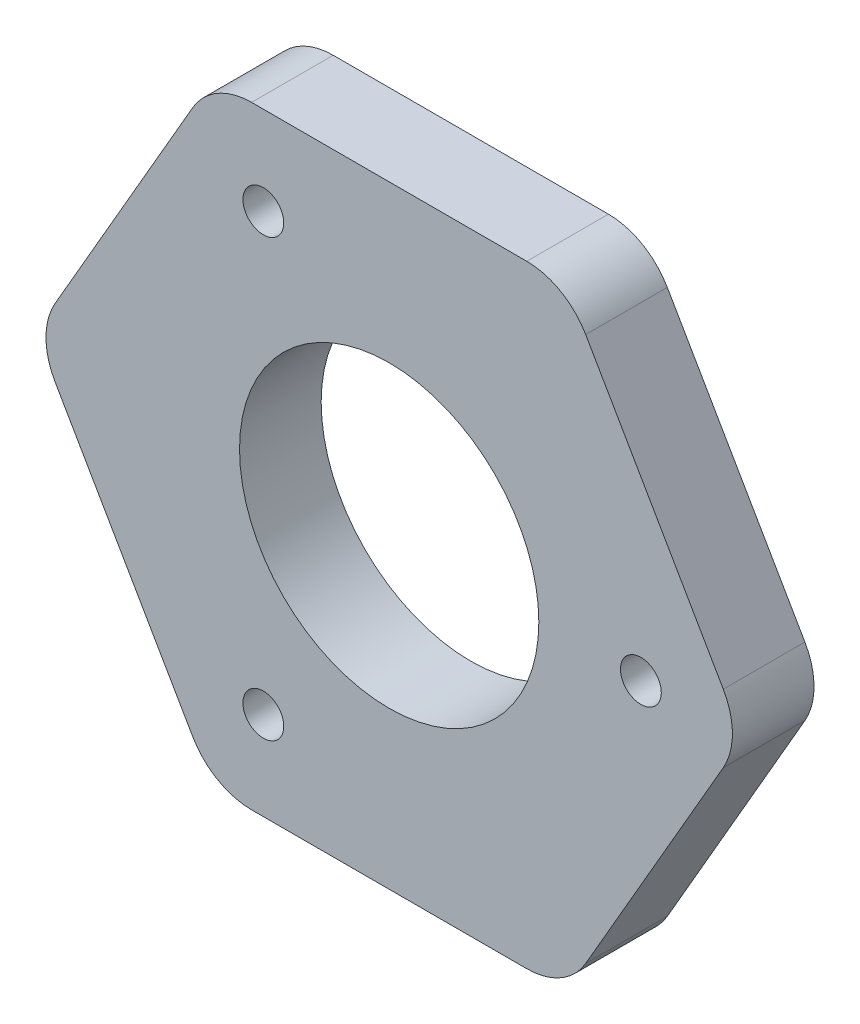
ISO-10303-21;
HEADER;
FILE_DESCRIPTION(('STEP AP214'),'2;1');
FILE_NAME('part.step','',(''),(''),'','','');
FILE_SCHEMA(('AUTOMOTIVE_DESIGN { 1 0 10303 214 1 1 1 1 }'));
ENDSEC;
DATA;
#1=APPLICATION_CONTEXT('core data for automotive mechanical design processes');
#2=APPLICATION_PROTOCOL_DEFINITION('international standard','automotive_design',2000,#1);
#3=PRODUCT_CONTEXT('',#1,'mechanical');
#4=PRODUCT('Part','Part','',(#3));
#5=PRODUCT_RELATED_PRODUCT_CATEGORY('part','',(#4));
#6=PRODUCT_DEFINITION_FORMATION('','',#4);
#7=PRODUCT_DEFINITION_CONTEXT('part definition',#1,'design');
#8=PRODUCT_DEFINITION('design','',#6,#7);
#9=PRODUCT_DEFINITION_SHAPE('','',#8);
#10=(LENGTH_UNIT() NAMED_UNIT(*) SI_UNIT(.MILLI.,.METRE.));
#11=(NAMED_UNIT(*) PLANE_ANGLE_UNIT() SI_UNIT($,.RADIAN.));
#12=(NAMED_UNIT(*) SI_UNIT($,.STERADIAN.) SOLID_ANGLE_UNIT());
#13=UNCERTAINTY_MEASURE_WITH_UNIT(LENGTH_MEASURE(1.E-05),#10,'distance_accuracy_value','');
#14=(GEOMETRIC_REPRESENTATION_CONTEXT(3) GLOBAL_UNCERTAINTY_ASSIGNED_CONTEXT((#13)) GLOBAL_UNIT_ASSIGNED_CONTEXT((#10,
#11,#12)) REPRESENTATION_CONTEXT('',''));
#15=CARTESIAN_POINT('',(0.,0.,0.));
#16=DIRECTION('',(0.,0.,1.));
#17=DIRECTION('',(1.,0.,0.));
#18=AXIS2_PLACEMENT_3D('',#15,#16,#17);
#19=CARTESIAN_POINT('',(-57.1009704413771,86.3066604984849,6.));
#20=DIRECTION('',(0.,0.,1.));
#21=DIRECTION('',(1.,0.,0.));
#22=AXIS2_PLACEMENT_3D('',#19,#20,#21);
#23=PLANE('',#22);
#24=CARTESIAN_POINT('',(-46.9877217872398,68.7899999999777,6.));
#25=DIRECTION('',(0.,0.,1.));
#26=DIRECTION('',(1.,0.,0.));
#27=AXIS2_PLACEMENT_3D('',#24,#25,#26);
#28=CIRCLE('',#27,10.999999999969);
#29=CARTESIAN_POINT('',(-35.9877217872708,68.7899999999777,6.));
#30=VERTEX_POINT('',#29);
#31=EDGE_CURVE('E299',#30,#30,#28,.T.);
#32=ORIENTED_EDGE('',*,*,#31,.F.);
#33=EDGE_LOOP('',(#32));
#34=FACE_BOUND('',#33,.T.);
#35=CARTESIAN_POINT('',(-56.2377217872788,52.7685300299879,6.));
#36=DIRECTION('',(0.,0.,1.));
#37=DIRECTION('',(1.,0.,0.));
#38=AXIS2_PLACEMENT_3D('',#35,#36,#37);
#39=CIRCLE('',#38,1.5);
#40=CARTESIAN_POINT('',(-54.7377217872788,52.7685300299879,6.));
#41=VERTEX_POINT('',#40);
#42=EDGE_CURVE('E166',#41,#41,#39,.T.);
#43=ORIENTED_EDGE('',*,*,#42,.F.);
#44=EDGE_LOOP('',(#43));
#45=FACE_BOUND('',#44,.T.);
#46=CARTESIAN_POINT('',(-57.1009704413771,86.3066604984849,6.));
#47=DIRECTION('',(0.,0.,1.));
#48=DIRECTION('',(1.,0.,0.));
#49=AXIS2_PLACEMENT_3D('',#46,#47,#48);
#50=CIRCLE('',#49,5.00000000000002);
#51=CARTESIAN_POINT('',(-57.1009704413761,91.3066604984849,6.));
#52=VERTEX_POINT('',#51);
#53=CARTESIAN_POINT('',(-61.4310974603012,88.8066604984817,6.));
#54=VERTEX_POINT('',#53);
#55=EDGE_CURVE('E185',#52,#54,#50,.T.);
#56=ORIENTED_EDGE('',*,*,#55,.T.);
#57=DIRECTION('',(-0.499999999999351,-0.866025403784813,0.));
#58=VECTOR('',#57,1.);
#59=CARTESIAN_POINT('',(-61.4310974603012,88.8066604984817,6.));
#60=LINE('',#59,#58);
#61=CARTESIAN_POINT('',(-71.5443461143398,71.2900000000789,6.));
#62=VERTEX_POINT('',#61);
#63=EDGE_CURVE('E113',#54,#62,#60,.T.);
#64=ORIENTED_EDGE('',*,*,#63,.T.);
#65=CARTESIAN_POINT('',(-67.2142190954157,68.7900000000821,6.));
#66=DIRECTION('',(0.,0.,1.));
#67=DIRECTION('',(1.,0.,0.));
#68=AXIS2_PLACEMENT_3D('',#65,#66,#67);
#69=CIRCLE('',#68,5.00000000000002);
#70=CARTESIAN_POINT('',(-71.5443461143394,66.2900000000848,6.));
#71=VERTEX_POINT('',#70);
#72=EDGE_CURVE('E212',#62,#71,#69,.T.);
#73=ORIENTED_EDGE('',*,*,#72,.T.);
#74=DIRECTION('',(0.499999999999477,-0.866025403784741,0.));
#75=VECTOR('',#74,1.);
#76=CARTESIAN_POINT('',(-71.5443461143394,66.2900000000848,6.));
#77=LINE('',#76,#75);
#78=CARTESIAN_POINT('',(-61.4310974602983,48.7733395016834,6.));
#79=VERTEX_POINT('',#78);
#80=EDGE_CURVE('E231',#71,#79,#77,.T.);
#81=ORIENTED_EDGE('',*,*,#80,.T.);
#82=CARTESIAN_POINT('',(-57.1009704413746,51.2733395016808,6.));
#83=DIRECTION('',(0.,0.,1.));
#84=DIRECTION('',(1.,0.,0.));
#85=AXIS2_PLACEMENT_3D('',#82,#83,#84);
#86=CIRCLE('',#85,5.);
#87=CARTESIAN_POINT('',(-57.1009704413746,46.2733395016808,6.));
#88=VERTEX_POINT('',#87);
#89=EDGE_CURVE('E228',#79,#88,#86,.T.);
#90=ORIENTED_EDGE('',*,*,#89,.T.);
#91=DIRECTION('',(1.,0.,0.));
#92=VECTOR('',#91,1.);
#93=CARTESIAN_POINT('',(-57.1009704413746,46.2733395016808,6.));
#94=LINE('',#93,#92);
#95=CARTESIAN_POINT('',(-36.8744731332711,46.2733395016808,6.));
#96=VERTEX_POINT('',#95);
#97=EDGE_CURVE('E230',#88,#96,#94,.T.);
#98=ORIENTED_EDGE('',*,*,#97,.T.);
#99=CARTESIAN_POINT('',(-36.8744731332807,51.2733395016808,6.));
#100=DIRECTION('',(0.,0.,1.));
#101=DIRECTION('',(1.,0.,0.));
#102=AXIS2_PLACEMENT_3D('',#99,#100,#101);
#103=CIRCLE('',#102,5.00000000000002);
#104=CARTESIAN_POINT('',(-32.5443461143537,48.7733395016891,6.));
#105=VERTEX_POINT('',#104);
#106=EDGE_CURVE('E233',#96,#105,#103,.T.);
#107=ORIENTED_EDGE('',*,*,#106,.T.);
#108=DIRECTION('',(0.500000000000004,0.866025403784436,0.));
#109=VECTOR('',#108,1.);
#110=CARTESIAN_POINT('',(-32.5443461143537,48.7733395016891,6.));
#111=LINE('',#110,#109);
#112=CARTESIAN_POINT('',(-22.4310974603018,66.2900000000843,6.));
#113=VERTEX_POINT('',#112);
#114=EDGE_CURVE('E239',#105,#113,#111,.T.);
#115=ORIENTED_EDGE('',*,*,#114,.T.);
#116=CARTESIAN_POINT('',(-26.761224479224,68.7900000000843,6.));
#117=DIRECTION('',(0.,0.,1.));
#118=DIRECTION('',(1.,0.,0.));
#119=AXIS2_PLACEMENT_3D('',#116,#117,#118);
#120=CIRCLE('',#119,5.00000000000002);
#121=CARTESIAN_POINT('',(-22.4310974603015,71.2900000000838,6.));
#122=VERTEX_POINT('',#121);
#123=EDGE_CURVE('E144',#113,#122,#120,.T.);
#124=ORIENTED_EDGE('',*,*,#123,.T.);
#125=DIRECTION('',(-0.499999999999893,0.8660254037845,0.));
#126=VECTOR('',#125,1.);
#127=CARTESIAN_POINT('',(-22.4310974603015,71.2900000000838,6.));
#128=LINE('',#127,#126);
#129=CARTESIAN_POINT('',(-32.5443461143511,88.8066604984802,6.));
#130=VERTEX_POINT('',#129);
#131=EDGE_CURVE('E138',#122,#130,#128,.T.);
#132=ORIENTED_EDGE('',*,*,#131,.T.);
#133=CARTESIAN_POINT('',(-36.8744731332736,86.3066604984808,6.));
#134=DIRECTION('',(0.,0.,1.));
#135=DIRECTION('',(1.,0.,0.));
#136=AXIS2_PLACEMENT_3D('',#133,#134,#135);
#137=CIRCLE('',#136,5.00000000000002);
#138=CARTESIAN_POINT('',(-36.8744731332726,91.3066604984808,6.));
#139=VERTEX_POINT('',#138);
#140=EDGE_CURVE('E142',#130,#139,#137,.T.);
#141=ORIENTED_EDGE('',*,*,#140,.T.);
#142=DIRECTION('',(-1.,2.05835754897431E-13,0.));
#143=VECTOR('',#142,1.);
#144=CARTESIAN_POINT('',(-36.8744731332726,91.3066604984808,6.));
#145=LINE('',#144,#143);
#146=EDGE_CURVE('E58',#139,#52,#145,.T.);
#147=ORIENTED_EDGE('',*,*,#146,.T.);
#148=EDGE_LOOP('',(#56,#64,#73,#81,#90,#98,#107,#115,#124,#132,#141,#147));
#149=FACE_BOUND('',#148,.T.);
#150=CARTESIAN_POINT('',(-28.48772178724,68.7899999999329,6.));
#151=DIRECTION('',(0.,0.,1.));
#152=DIRECTION('',(1.,0.,0.));
#153=AXIS2_PLACEMENT_3D('',#150,#151,#152);
#154=CIRCLE('',#153,1.49999999998257);
#155=CARTESIAN_POINT('',(-26.9877217872574,68.7899999999329,6.));
#156=VERTEX_POINT('',#155);
#157=EDGE_CURVE('E305',#156,#156,#154,.T.);
#158=ORIENTED_EDGE('',*,*,#157,.F.);
#159=EDGE_LOOP('',(#158));
#160=FACE_BOUND('',#159,.T.);
#161=CARTESIAN_POINT('',(-56.2377217872012,84.8114699700121,6.));
#162=DIRECTION('',(0.,0.,1.));
#163=DIRECTION('',(1.,0.,0.));
#164=AXIS2_PLACEMENT_3D('',#161,#162,#163);
#165=CIRCLE('',#164,1.49999999992592);
#166=CARTESIAN_POINT('',(-54.7377217872752,84.8114699700121,6.));
#167=VERTEX_POINT('',#166);
#168=EDGE_CURVE('E290',#167,#167,#165,.T.);
#169=ORIENTED_EDGE('',*,*,#168,.F.);
#170=EDGE_LOOP('',(#169));
#171=FACE_BOUND('',#170,.T.);
#172=ADVANCED_FACE('F41',(#34,#45,#149,#160,#171),#23,.T.);
#173=CARTESIAN_POINT('',(-57.1009704413771,86.3066604984849,0.));
#174=DIRECTION('',(0.,0.,1.));
#175=DIRECTION('',(1.,0.,0.));
#176=AXIS2_PLACEMENT_3D('',#173,#174,#175);
#177=PLANE('',#176);
#178=CARTESIAN_POINT('',(-57.1009704413771,86.3066604984849,0.));
#179=DIRECTION('',(0.,0.,1.));
#180=DIRECTION('',(1.,0.,0.));
#181=AXIS2_PLACEMENT_3D('',#178,#179,#180);
#182=CIRCLE('',#181,5.00000000000002);
#183=CARTESIAN_POINT('',(-57.1009704413761,91.3066604984849,0.));
#184=VERTEX_POINT('',#183);
#185=CARTESIAN_POINT('',(-61.4310974603012,88.8066604984817,0.));
#186=VERTEX_POINT('',#185);
#187=EDGE_CURVE('E162',#184,#186,#182,.T.);
#188=ORIENTED_EDGE('',*,*,#187,.F.);
#189=DIRECTION('',(-1.,2.05835754897431E-13,0.));
#190=VECTOR('',#189,1.);
#191=CARTESIAN_POINT('',(-36.8744731332726,91.3066604984808,0.));
#192=LINE('',#191,#190);
#193=CARTESIAN_POINT('',(-36.8744731332726,91.3066604984808,0.));
#194=VERTEX_POINT('',#193);
#195=EDGE_CURVE('E105',#194,#184,#192,.T.);
#196=ORIENTED_EDGE('',*,*,#195,.F.);
#197=CARTESIAN_POINT('',(-36.8744731332736,86.3066604984808,0.));
#198=DIRECTION('',(0.,0.,1.));
#199=DIRECTION('',(1.,0.,0.));
#200=AXIS2_PLACEMENT_3D('',#197,#198,#199);
#201=CIRCLE('',#200,5.00000000000002);
#202=CARTESIAN_POINT('',(-32.5443461143511,88.8066604984802,0.));
#203=VERTEX_POINT('',#202);
#204=EDGE_CURVE('E99',#203,#194,#201,.T.);
#205=ORIENTED_EDGE('',*,*,#204,.F.);
#206=DIRECTION('',(-0.499999999999893,0.8660254037845,0.));
#207=VECTOR('',#206,1.);
#208=CARTESIAN_POINT('',(-22.4310974603015,71.2900000000838,0.));
#209=LINE('',#208,#207);
#210=CARTESIAN_POINT('',(-22.4310974603015,71.2900000000838,0.));
#211=VERTEX_POINT('',#210);
#212=EDGE_CURVE('E152',#211,#203,#209,.T.);
#213=ORIENTED_EDGE('',*,*,#212,.F.);
#214=CARTESIAN_POINT('',(-26.761224479224,68.7900000000843,0.));
#215=DIRECTION('',(0.,0.,1.));
#216=DIRECTION('',(1.,0.,0.));
#217=AXIS2_PLACEMENT_3D('',#214,#215,#216);
#218=CIRCLE('',#217,5.00000000000002);
#219=CARTESIAN_POINT('',(-22.4310974603018,66.2900000000843,0.));
#220=VERTEX_POINT('',#219);
#221=EDGE_CURVE('E180',#220,#211,#218,.T.);
#222=ORIENTED_EDGE('',*,*,#221,.F.);
#223=DIRECTION('',(0.500000000000004,0.866025403784436,0.));
#224=VECTOR('',#223,1.);
#225=CARTESIAN_POINT('',(-32.5443461143537,48.7733395016891,0.));
#226=LINE('',#225,#224);
#227=CARTESIAN_POINT('',(-32.5443461143537,48.7733395016891,0.));
#228=VERTEX_POINT('',#227);
#229=EDGE_CURVE('E178',#228,#220,#226,.T.);
#230=ORIENTED_EDGE('',*,*,#229,.F.);
#231=CARTESIAN_POINT('',(-36.8744731332807,51.2733395016808,0.));
#232=DIRECTION('',(0.,0.,1.));
#233=DIRECTION('',(1.,0.,0.));
#234=AXIS2_PLACEMENT_3D('',#231,#232,#233);
#235=CIRCLE('',#234,5.00000000000002);
#236=CARTESIAN_POINT('',(-36.8744731332711,46.2733395016808,0.));
#237=VERTEX_POINT('',#236);
#238=EDGE_CURVE('E176',#237,#228,#235,.T.);
#239=ORIENTED_EDGE('',*,*,#238,.F.);
#240=DIRECTION('',(1.,0.,0.));
#241=VECTOR('',#240,1.);
#242=CARTESIAN_POINT('',(-57.1009704413746,46.2733395016808,0.));
#243=LINE('',#242,#241);
#244=CARTESIAN_POINT('',(-57.1009704413746,46.2733395016808,0.));
#245=VERTEX_POINT('',#244);
#246=EDGE_CURVE('E174',#245,#237,#243,.T.);
#247=ORIENTED_EDGE('',*,*,#246,.F.);
#248=CARTESIAN_POINT('',(-57.1009704413746,51.2733395016808,0.));
#249=DIRECTION('',(0.,0.,1.));
#250=DIRECTION('',(1.,0.,0.));
#251=AXIS2_PLACEMENT_3D('',#248,#249,#250);
#252=CIRCLE('',#251,5.);
#253=CARTESIAN_POINT('',(-61.4310974602983,48.7733395016834,0.));
#254=VERTEX_POINT('',#253);
#255=EDGE_CURVE('E172',#254,#245,#252,.T.);
#256=ORIENTED_EDGE('',*,*,#255,.F.);
#257=DIRECTION('',(0.499999999999477,-0.866025403784741,0.));
#258=VECTOR('',#257,1.);
#259=CARTESIAN_POINT('',(-71.5443461143394,66.2900000000848,0.));
#260=LINE('',#259,#258);
#261=CARTESIAN_POINT('',(-71.5443461143394,66.2900000000848,0.));
#262=VERTEX_POINT('',#261);
#263=EDGE_CURVE('E170',#262,#254,#260,.T.);
#264=ORIENTED_EDGE('',*,*,#263,.F.);
#265=CARTESIAN_POINT('',(-67.2142190954157,68.7900000000821,0.));
#266=DIRECTION('',(0.,0.,1.));
#267=DIRECTION('',(1.,0.,0.));
#268=AXIS2_PLACEMENT_3D('',#265,#266,#267);
#269=CIRCLE('',#268,5.00000000000002);
#270=CARTESIAN_POINT('',(-71.5443461143398,71.2900000000789,0.));
#271=VERTEX_POINT('',#270);
#272=EDGE_CURVE('E168',#271,#262,#269,.T.);
#273=ORIENTED_EDGE('',*,*,#272,.F.);
#274=DIRECTION('',(-0.499999999999351,-0.866025403784813,0.));
#275=VECTOR('',#274,1.);
#276=CARTESIAN_POINT('',(-61.4310974603012,88.8066604984817,0.));
#277=LINE('',#276,#275);
#278=EDGE_CURVE('E165',#186,#271,#277,.T.);
#279=ORIENTED_EDGE('',*,*,#278,.F.);
#280=EDGE_LOOP('',(#188,#196,#205,#213,#222,#230,#239,#247,#256,#264,#273,#279));
#281=FACE_BOUND('',#280,.T.);
#282=CARTESIAN_POINT('',(-56.2377217872788,52.7685300299879,0.));
#283=DIRECTION('',(0.,0.,1.));
#284=DIRECTION('',(1.,0.,0.));
#285=AXIS2_PLACEMENT_3D('',#282,#283,#284);
#286=CIRCLE('',#285,1.5);
#287=CARTESIAN_POINT('',(-54.7377217872788,52.7685300299879,0.));
#288=VERTEX_POINT('',#287);
#289=EDGE_CURVE('E308',#288,#288,#286,.T.);
#290=ORIENTED_EDGE('',*,*,#289,.T.);
#291=EDGE_LOOP('',(#290));
#292=FACE_BOUND('',#291,.T.);
#293=CARTESIAN_POINT('',(-28.48772178724,68.7899999999329,0.));
#294=DIRECTION('',(0.,0.,1.));
#295=DIRECTION('',(1.,0.,0.));
#296=AXIS2_PLACEMENT_3D('',#293,#294,#295);
#297=CIRCLE('',#296,1.49999999998257);
#298=CARTESIAN_POINT('',(-26.9877217872574,68.7899999999329,0.));
#299=VERTEX_POINT('',#298);
#300=EDGE_CURVE('E302',#299,#299,#297,.T.);
#301=ORIENTED_EDGE('',*,*,#300,.T.);
#302=EDGE_LOOP('',(#301));
#303=FACE_BOUND('',#302,.T.);
#304=CARTESIAN_POINT('',(-46.9877217872398,68.7899999999777,0.));
#305=DIRECTION('',(0.,0.,1.));
#306=DIRECTION('',(1.,0.,0.));
#307=AXIS2_PLACEMENT_3D('',#304,#305,#306);
#308=CIRCLE('',#307,10.999999999969);
#309=CARTESIAN_POINT('',(-35.9877217872708,68.7899999999777,0.));
#310=VERTEX_POINT('',#309);
#311=EDGE_CURVE('E296',#310,#310,#308,.T.);
#312=ORIENTED_EDGE('',*,*,#311,.T.);
#313=EDGE_LOOP('',(#312));
#314=FACE_BOUND('',#313,.T.);
#315=CARTESIAN_POINT('',(-56.2377217872012,84.8114699700121,0.));
#316=DIRECTION('',(0.,0.,1.));
#317=DIRECTION('',(1.,0.,0.));
#318=AXIS2_PLACEMENT_3D('',#315,#316,#317);
#319=CIRCLE('',#318,1.49999999992592);
#320=CARTESIAN_POINT('',(-54.7377217872752,84.8114699700121,0.));
#321=VERTEX_POINT('',#320);
#322=EDGE_CURVE('E293',#321,#321,#319,.T.);
#323=ORIENTED_EDGE('',*,*,#322,.T.);
#324=EDGE_LOOP('',(#323));
#325=FACE_BOUND('',#324,.T.);
#326=ADVANCED_FACE('F216',(#281,#292,#303,#314,#325),#177,.F.);
#327=CARTESIAN_POINT('',(-57.1009704413771,86.3066604984849,6.));
#328=DIRECTION('',(0.,0.,-1.));
#329=DIRECTION('',(-1.,0.,0.));
#330=AXIS2_PLACEMENT_3D('',#327,#328,#329);
#331=CYLINDRICAL_SURFACE('',#330,5.00000000000002);
#332=ORIENTED_EDGE('',*,*,#187,.T.);
#333=DIRECTION('',(0.,0.,-1.));
#334=VECTOR('',#333,1.);
#335=CARTESIAN_POINT('',(-61.4310974603012,88.8066604984817,6.));
#336=LINE('',#335,#334);
#337=EDGE_CURVE('E11',#54,#186,#336,.T.);
#338=ORIENTED_EDGE('',*,*,#337,.F.);
#339=ORIENTED_EDGE('',*,*,#55,.F.);
#340=DIRECTION('',(0.,0.,-1.));
#341=VECTOR('',#340,1.);
#342=CARTESIAN_POINT('',(-57.1009704413761,91.3066604984849,6.));
#343=LINE('',#342,#341);
#344=EDGE_CURVE('E158',#52,#184,#343,.T.);
#345=ORIENTED_EDGE('',*,*,#344,.T.);
#346=EDGE_LOOP('',(#332,#338,#339,#345));
#347=FACE_BOUND('',#346,.T.);
#348=ADVANCED_FACE('F43',(#347),#331,.T.);
#349=CARTESIAN_POINT('',(-61.4310974603012,88.8066604984817,6.));
#350=DIRECTION('',(0.866025403784813,-0.499999999999351,0.));
#351=DIRECTION('',(0.499999999999351,0.866025403784813,0.));
#352=AXIS2_PLACEMENT_3D('',#349,#350,#351);
#353=PLANE('',#352);
#354=ORIENTED_EDGE('',*,*,#278,.T.);
#355=DIRECTION('',(0.,0.,-1.));
#356=VECTOR('',#355,1.);
#357=CARTESIAN_POINT('',(-71.5443461143398,71.2900000000789,6.));
#358=LINE('',#357,#356);
#359=EDGE_CURVE('E50',#62,#271,#358,.T.);
#360=ORIENTED_EDGE('',*,*,#359,.F.);
#361=ORIENTED_EDGE('',*,*,#63,.F.);
#362=ORIENTED_EDGE('',*,*,#337,.T.);
#363=EDGE_LOOP('',(#354,#360,#361,#362));
#364=FACE_BOUND('',#363,.T.);
#365=ADVANCED_FACE('F428',(#364),#353,.F.);
#366=CARTESIAN_POINT('',(-67.2142190954157,68.7900000000821,6.));
#367=DIRECTION('',(0.,0.,-1.));
#368=DIRECTION('',(-1.,0.,0.));
#369=AXIS2_PLACEMENT_3D('',#366,#367,#368);
#370=CYLINDRICAL_SURFACE('',#369,5.00000000000002);
#371=ORIENTED_EDGE('',*,*,#272,.T.);
#372=DIRECTION('',(0.,0.,-1.));
#373=VECTOR('',#372,1.);
#374=CARTESIAN_POINT('',(-71.5443461143394,66.2900000000848,6.));
#375=LINE('',#374,#373);
#376=EDGE_CURVE('E204',#71,#262,#375,.T.);
#377=ORIENTED_EDGE('',*,*,#376,.F.);
#378=ORIENTED_EDGE('',*,*,#72,.F.);
#379=ORIENTED_EDGE('',*,*,#359,.T.);
#380=EDGE_LOOP('',(#371,#377,#378,#379));
#381=FACE_BOUND('',#380,.T.);
#382=ADVANCED_FACE('F210',(#381),#370,.T.);
#383=CARTESIAN_POINT('',(-71.5443461143394,66.2900000000848,6.));
#384=DIRECTION('',(0.866025403784741,0.499999999999477,0.));
#385=DIRECTION('',(-0.499999999999477,0.866025403784741,0.));
#386=AXIS2_PLACEMENT_3D('',#383,#384,#385);
#387=PLANE('',#386);
#388=ORIENTED_EDGE('',*,*,#263,.T.);
#389=DIRECTION('',(0.,0.,-1.));
#390=VECTOR('',#389,1.);
#391=CARTESIAN_POINT('',(-61.4310974602983,48.7733395016834,6.));
#392=LINE('',#391,#390);
#393=EDGE_CURVE('E201',#79,#254,#392,.T.);
#394=ORIENTED_EDGE('',*,*,#393,.F.);
#395=ORIENTED_EDGE('',*,*,#80,.F.);
#396=ORIENTED_EDGE('',*,*,#376,.T.);
#397=EDGE_LOOP('',(#388,#394,#395,#396));
#398=FACE_BOUND('',#397,.T.);
#399=ADVANCED_FACE('F222',(#398),#387,.F.);
#400=CARTESIAN_POINT('',(-57.1009704413746,51.2733395016808,6.));
#401=DIRECTION('',(0.,0.,-1.));
#402=DIRECTION('',(-1.,0.,0.));
#403=AXIS2_PLACEMENT_3D('',#400,#401,#402);
#404=CYLINDRICAL_SURFACE('',#403,5.);
#405=ORIENTED_EDGE('',*,*,#255,.T.);
#406=DIRECTION('',(0.,0.,-1.));
#407=VECTOR('',#406,1.);
#408=CARTESIAN_POINT('',(-57.1009704413746,46.2733395016808,6.));
#409=LINE('',#408,#407);
#410=EDGE_CURVE('E198',#88,#245,#409,.T.);
#411=ORIENTED_EDGE('',*,*,#410,.F.);
#412=ORIENTED_EDGE('',*,*,#89,.F.);
#413=ORIENTED_EDGE('',*,*,#393,.T.);
#414=EDGE_LOOP('',(#405,#411,#412,#413));
#415=FACE_BOUND('',#414,.T.);
#416=ADVANCED_FACE('F226',(#415),#404,.T.);
#417=CARTESIAN_POINT('',(-57.1009704413746,46.2733395016808,6.));
#418=DIRECTION('',(0.,1.,0.));
#419=DIRECTION('',(0.,0.,1.));
#420=AXIS2_PLACEMENT_3D('',#417,#418,#419);
#421=PLANE('',#420);
#422=ORIENTED_EDGE('',*,*,#246,.T.);
#423=DIRECTION('',(0.,0.,-1.));
#424=VECTOR('',#423,1.);
#425=CARTESIAN_POINT('',(-36.8744731332711,46.2733395016808,6.));
#426=LINE('',#425,#424);
#427=EDGE_CURVE('E195',#96,#237,#426,.T.);
#428=ORIENTED_EDGE('',*,*,#427,.F.);
#429=ORIENTED_EDGE('',*,*,#97,.F.);
#430=ORIENTED_EDGE('',*,*,#410,.T.);
#431=EDGE_LOOP('',(#422,#428,#429,#430));
#432=FACE_BOUND('',#431,.T.);
#433=ADVANCED_FACE('F389',(#432),#421,.F.);
#434=CARTESIAN_POINT('',(-36.8744731332807,51.2733395016808,6.));
#435=DIRECTION('',(0.,0.,-1.));
#436=DIRECTION('',(-1.,0.,0.));
#437=AXIS2_PLACEMENT_3D('',#434,#435,#436);
#438=CYLINDRICAL_SURFACE('',#437,5.00000000000002);
#439=ORIENTED_EDGE('',*,*,#238,.T.);
#440=DIRECTION('',(0.,0.,-1.));
#441=VECTOR('',#440,1.);
#442=CARTESIAN_POINT('',(-32.5443461143537,48.7733395016891,6.));
#443=LINE('',#442,#441);
#444=EDGE_CURVE('E192',#105,#228,#443,.T.);
#445=ORIENTED_EDGE('',*,*,#444,.F.);
#446=ORIENTED_EDGE('',*,*,#106,.F.);
#447=ORIENTED_EDGE('',*,*,#427,.T.);
#448=EDGE_LOOP('',(#439,#445,#446,#447));
#449=FACE_BOUND('',#448,.T.);
#450=ADVANCED_FACE('F379',(#449),#438,.T.);
#451=CARTESIAN_POINT('',(-32.5443461143537,48.7733395016891,6.));
#452=DIRECTION('',(-0.866025403784436,0.500000000000004,0.));
#453=DIRECTION('',(-0.500000000000004,-0.866025403784436,0.));
#454=AXIS2_PLACEMENT_3D('',#451,#452,#453);
#455=PLANE('',#454);
#456=ORIENTED_EDGE('',*,*,#229,.T.);
#457=DIRECTION('',(0.,0.,-1.));
#458=VECTOR('',#457,1.);
#459=CARTESIAN_POINT('',(-22.4310974603018,66.2900000000843,6.));
#460=LINE('',#459,#458);
#461=EDGE_CURVE('E189',#113,#220,#460,.T.);
#462=ORIENTED_EDGE('',*,*,#461,.F.);
#463=ORIENTED_EDGE('',*,*,#114,.F.);
#464=ORIENTED_EDGE('',*,*,#444,.T.);
#465=EDGE_LOOP('',(#456,#462,#463,#464));
#466=FACE_BOUND('',#465,.T.);
#467=ADVANCED_FACE('F245',(#466),#455,.F.);
#468=CARTESIAN_POINT('',(-26.761224479224,68.7900000000843,6.));
#469=DIRECTION('',(0.,0.,-1.));
#470=DIRECTION('',(-1.,0.,0.));
#471=AXIS2_PLACEMENT_3D('',#468,#469,#470);
#472=CYLINDRICAL_SURFACE('',#471,5.00000000000002);
#473=ORIENTED_EDGE('',*,*,#221,.T.);
#474=DIRECTION('',(0.,0.,-1.));
#475=VECTOR('',#474,1.);
#476=CARTESIAN_POINT('',(-22.4310974603015,71.2900000000838,6.));
#477=LINE('',#476,#475);
#478=EDGE_CURVE('E153',#122,#211,#477,.T.);
#479=ORIENTED_EDGE('',*,*,#478,.F.);
#480=ORIENTED_EDGE('',*,*,#123,.F.);
#481=ORIENTED_EDGE('',*,*,#461,.T.);
#482=EDGE_LOOP('',(#473,#479,#480,#481));
#483=FACE_BOUND('',#482,.T.);
#484=ADVANCED_FACE('F249',(#483),#472,.T.);
#485=CARTESIAN_POINT('',(-22.4310974603015,71.2900000000838,6.));
#486=DIRECTION('',(-0.8660254037845,-0.499999999999893,0.));
#487=DIRECTION('',(0.499999999999893,-0.8660254037845,0.));
#488=AXIS2_PLACEMENT_3D('',#485,#486,#487);
#489=PLANE('',#488);
#490=ORIENTED_EDGE('',*,*,#212,.T.);
#491=DIRECTION('',(0.,0.,-1.));
#492=VECTOR('',#491,1.);
#493=CARTESIAN_POINT('',(-32.5443461143511,88.8066604984802,6.));
#494=LINE('',#493,#492);
#495=EDGE_CURVE('E149',#130,#203,#494,.T.);
#496=ORIENTED_EDGE('',*,*,#495,.F.);
#497=ORIENTED_EDGE('',*,*,#131,.F.);
#498=ORIENTED_EDGE('',*,*,#478,.T.);
#499=EDGE_LOOP('',(#490,#496,#497,#498));
#500=FACE_BOUND('',#499,.T.);
#501=ADVANCED_FACE('F150',(#500),#489,.F.);
#502=CARTESIAN_POINT('',(-36.8744731332736,86.3066604984808,6.));
#503=DIRECTION('',(0.,0.,-1.));
#504=DIRECTION('',(-1.,0.,0.));
#505=AXIS2_PLACEMENT_3D('',#502,#503,#504);
#506=CYLINDRICAL_SURFACE('',#505,5.00000000000002);
#507=ORIENTED_EDGE('',*,*,#204,.T.);
#508=DIRECTION('',(0.,0.,-1.));
#509=VECTOR('',#508,1.);
#510=CARTESIAN_POINT('',(-36.8744731332726,91.3066604984808,6.));
#511=LINE('',#510,#509);
#512=EDGE_CURVE('E154',#139,#194,#511,.T.);
#513=ORIENTED_EDGE('',*,*,#512,.F.);
#514=ORIENTED_EDGE('',*,*,#140,.F.);
#515=ORIENTED_EDGE('',*,*,#495,.T.);
#516=EDGE_LOOP('',(#507,#513,#514,#515));
#517=FACE_BOUND('',#516,.T.);
#518=ADVANCED_FACE('F156',(#517),#506,.T.);
#519=CARTESIAN_POINT('',(-36.8744731332726,91.3066604984808,6.));
#520=DIRECTION('',(-2.05835754897431E-13,-1.,0.));
#521=DIRECTION('',(1.,-2.05835754897431E-13,0.));
#522=AXIS2_PLACEMENT_3D('',#519,#520,#521);
#523=PLANE('',#522);
#524=ORIENTED_EDGE('',*,*,#195,.T.);
#525=ORIENTED_EDGE('',*,*,#344,.F.);
#526=ORIENTED_EDGE('',*,*,#146,.F.);
#527=ORIENTED_EDGE('',*,*,#512,.T.);
#528=EDGE_LOOP('',(#524,#525,#526,#527));
#529=FACE_BOUND('',#528,.T.);
#530=ADVANCED_FACE('F253',(#529),#523,.F.);
#531=CARTESIAN_POINT('',(-56.2377217872788,52.7685300299879,6.));
#532=DIRECTION('',(0.,0.,-1.));
#533=DIRECTION('',(-1.,0.,0.));
#534=AXIS2_PLACEMENT_3D('',#531,#532,#533);
#535=CYLINDRICAL_SURFACE('',#534,1.5);
#536=ORIENTED_EDGE('',*,*,#42,.T.);
#537=EDGE_LOOP('',(#536));
#538=FACE_BOUND('',#537,.T.);
#539=ORIENTED_EDGE('',*,*,#289,.F.);
#540=EDGE_LOOP('',(#539));
#541=FACE_BOUND('',#540,.T.);
#542=ADVANCED_FACE('F255',(#538,#541),#535,.F.);
#543=CARTESIAN_POINT('',(-28.48772178724,68.7899999999329,6.));
#544=DIRECTION('',(0.,0.,-1.));
#545=DIRECTION('',(-1.,0.,0.));
#546=AXIS2_PLACEMENT_3D('',#543,#544,#545);
#547=CYLINDRICAL_SURFACE('',#546,1.49999999998257);
#548=ORIENTED_EDGE('',*,*,#157,.T.);
#549=EDGE_LOOP('',(#548));
#550=FACE_BOUND('',#549,.T.);
#551=ORIENTED_EDGE('',*,*,#300,.F.);
#552=EDGE_LOOP('',(#551));
#553=FACE_BOUND('',#552,.T.);
#554=ADVANCED_FACE('F261',(#550,#553),#547,.F.);
#555=CARTESIAN_POINT('',(-46.9877217872398,68.7899999999777,6.));
#556=DIRECTION('',(0.,0.,-1.));
#557=DIRECTION('',(-1.,0.,0.));
#558=AXIS2_PLACEMENT_3D('',#555,#556,#557);
#559=CYLINDRICAL_SURFACE('',#558,10.999999999969);
#560=ORIENTED_EDGE('',*,*,#31,.T.);
#561=EDGE_LOOP('',(#560));
#562=FACE_BOUND('',#561,.T.);
#563=ORIENTED_EDGE('',*,*,#311,.F.);
#564=EDGE_LOOP('',(#563));
#565=FACE_BOUND('',#564,.T.);
#566=ADVANCED_FACE('F277',(#562,#565),#559,.F.);
#567=CARTESIAN_POINT('',(-56.2377217872012,84.8114699700121,6.));
#568=DIRECTION('',(0.,0.,-1.));
#569=DIRECTION('',(-1.,0.,0.));
#570=AXIS2_PLACEMENT_3D('',#567,#568,#569);
#571=CYLINDRICAL_SURFACE('',#570,1.49999999992592);
#572=ORIENTED_EDGE('',*,*,#168,.T.);
#573=EDGE_LOOP('',(#572));
#574=FACE_BOUND('',#573,.T.);
#575=ORIENTED_EDGE('',*,*,#322,.F.);
#576=EDGE_LOOP('',(#575));
#577=FACE_BOUND('',#576,.T.);
#578=ADVANCED_FACE('F281',(#574,#577),#571,.F.);
#579=CLOSED_SHELL('',(#172,#326,#348,#365,#382,#399,#416,#433,#450,#467,#484,#501,#518,#530,
#542,#554,#566,#578));
#580=MANIFOLD_SOLID_BREP('B2',#579);
#581=ADVANCED_BREP_SHAPE_REPRESENTATION('',(#18,#580),#14);
#582=SHAPE_DEFINITION_REPRESENTATION(#9,#581);
ENDSEC;
END-ISO-10303-21;
